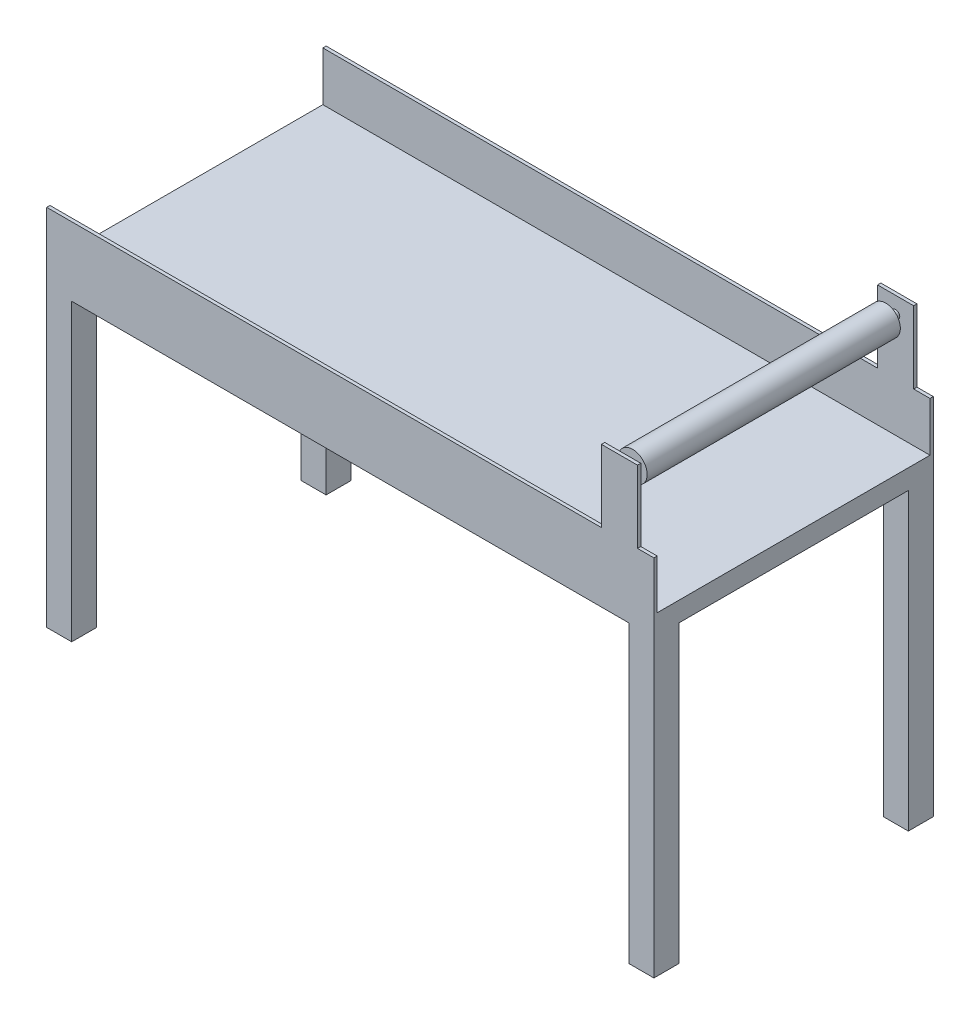
ISO-10303-21;
HEADER;
FILE_DESCRIPTION(('STEP AP214'),'2;1');
FILE_NAME('part.step','',(''),(''),'','','');
FILE_SCHEMA(('AUTOMOTIVE_DESIGN { 1 0 10303 214 1 1 1 1 }'));
ENDSEC;
DATA;
#1=APPLICATION_CONTEXT('core data for automotive mechanical design processes');
#2=APPLICATION_PROTOCOL_DEFINITION('international standard','automotive_design',2000,#1);
#3=PRODUCT_CONTEXT('',#1,'mechanical');
#4=PRODUCT('Part','Part','',(#3));
#5=PRODUCT_RELATED_PRODUCT_CATEGORY('part','',(#4));
#6=PRODUCT_DEFINITION_FORMATION('','',#4);
#7=PRODUCT_DEFINITION_CONTEXT('part definition',#1,'design');
#8=PRODUCT_DEFINITION('design','',#6,#7);
#9=PRODUCT_DEFINITION_SHAPE('','',#8);
#10=(LENGTH_UNIT() NAMED_UNIT(*) SI_UNIT(.MILLI.,.METRE.));
#11=(NAMED_UNIT(*) PLANE_ANGLE_UNIT() SI_UNIT($,.RADIAN.));
#12=(NAMED_UNIT(*) SI_UNIT($,.STERADIAN.) SOLID_ANGLE_UNIT());
#13=UNCERTAINTY_MEASURE_WITH_UNIT(LENGTH_MEASURE(1.E-05),#10,'distance_accuracy_value','');
#14=(GEOMETRIC_REPRESENTATION_CONTEXT(3) GLOBAL_UNCERTAINTY_ASSIGNED_CONTEXT((#13)) GLOBAL_UNIT_ASSIGNED_CONTEXT((#10,
#11,#12)) REPRESENTATION_CONTEXT('',''));
#15=CARTESIAN_POINT('',(0.,0.,0.));
#16=DIRECTION('',(0.,0.,1.));
#17=DIRECTION('',(1.,0.,0.));
#18=AXIS2_PLACEMENT_3D('',#15,#16,#17);
#19=CARTESIAN_POINT('',(0.,1110.,0.));
#20=DIRECTION('',(0.,1.,0.));
#21=DIRECTION('',(0.,0.,1.));
#22=AXIS2_PLACEMENT_3D('',#19,#20,#21);
#23=PLANE('',#22);
#24=DIRECTION('',(-1.,0.,0.));
#25=VECTOR('',#24,1.);
#26=CARTESIAN_POINT('',(2698.20716478403,1110.,842.4));
#27=LINE('',#26,#25);
#28=CARTESIAN_POINT('',(1852.4,1110.,842.4));
#29=VERTEX_POINT('',#28);
#30=CARTESIAN_POINT('',(1802.4,1110.,842.4));
#31=VERTEX_POINT('',#30);
#32=EDGE_CURVE('E294',#29,#31,#27,.T.);
#33=ORIENTED_EDGE('',*,*,#32,.T.);
#34=DIRECTION('',(0.,0.,-1.));
#35=VECTOR('',#34,1.);
#36=CARTESIAN_POINT('',(1802.4,1110.,852.399999999999));
#37=LINE('',#36,#35);
#38=CARTESIAN_POINT('',(1802.4,1110.,852.4));
#39=VERTEX_POINT('',#38);
#40=EDGE_CURVE('E52',#39,#31,#37,.T.);
#41=ORIENTED_EDGE('',*,*,#40,.F.);
#42=DIRECTION('',(1.,0.,0.));
#43=VECTOR('',#42,1.);
#44=CARTESIAN_POINT('',(0.,1110.,852.4));
#45=LINE('',#44,#43);
#46=CARTESIAN_POINT('',(1852.4,1110.,852.4));
#47=VERTEX_POINT('',#46);
#48=EDGE_CURVE('E246',#39,#47,#45,.T.);
#49=ORIENTED_EDGE('',*,*,#48,.T.);
#50=DIRECTION('',(0.,0.,-1.));
#51=VECTOR('',#50,1.);
#52=CARTESIAN_POINT('',(1852.4,1110.,0.));
#53=LINE('',#52,#51);
#54=EDGE_CURVE('E381',#47,#29,#53,.T.);
#55=ORIENTED_EDGE('',*,*,#54,.T.);
#56=EDGE_LOOP('',(#33,#41,#49,#55));
#57=FACE_BOUND('',#56,.T.);
#58=ADVANCED_FACE('F35',(#57),#23,.T.);
#59=CARTESIAN_POINT('',(0.,1110.,852.4));
#60=VERTEX_POINT('',#59);
#61=CARTESIAN_POINT('',(1692.4,1110.,852.4));
#62=VERTEX_POINT('',#61);
#63=EDGE_CURVE('E60',#60,#62,#45,.T.);
#64=ORIENTED_EDGE('',*,*,#63,.T.);
#65=DIRECTION('',(0.,0.,1.));
#66=VECTOR('',#65,1.);
#67=CARTESIAN_POINT('',(1692.4,1110.,852.399999999999));
#68=LINE('',#67,#66);
#69=CARTESIAN_POINT('',(1692.4,1110.,842.4));
#70=VERTEX_POINT('',#69);
#71=EDGE_CURVE('E242',#70,#62,#68,.T.);
#72=ORIENTED_EDGE('',*,*,#71,.F.);
#73=CARTESIAN_POINT('',(0.,1110.,842.4));
#74=VERTEX_POINT('',#73);
#75=EDGE_CURVE('E296',#70,#74,#27,.T.);
#76=ORIENTED_EDGE('',*,*,#75,.T.);
#77=DIRECTION('',(0.,0.,1.));
#78=VECTOR('',#77,1.);
#79=CARTESIAN_POINT('',(0.,1110.,0.));
#80=LINE('',#79,#78);
#81=EDGE_CURVE('E378',#74,#60,#80,.T.);
#82=ORIENTED_EDGE('',*,*,#81,.T.);
#83=EDGE_LOOP('',(#64,#72,#76,#82));
#84=FACE_BOUND('',#83,.T.);
#85=ADVANCED_FACE('F456',(#84),#23,.T.);
#86=DIRECTION('',(-1.,0.,0.));
#87=VECTOR('',#86,1.);
#88=CARTESIAN_POINT('',(0.,1110.,0.));
#89=LINE('',#88,#87);
#90=CARTESIAN_POINT('',(1852.4,1110.,0.));
#91=VERTEX_POINT('',#90);
#92=CARTESIAN_POINT('',(1802.4,1110.,0.));
#93=VERTEX_POINT('',#92);
#94=EDGE_CURVE('E385',#91,#93,#89,.T.);
#95=ORIENTED_EDGE('',*,*,#94,.T.);
#96=DIRECTION('',(0.,0.,-1.));
#97=VECTOR('',#96,1.);
#98=CARTESIAN_POINT('',(1802.4,1110.,0.));
#99=LINE('',#98,#97);
#100=CARTESIAN_POINT('',(1802.4,1110.,9.99999999999966));
#101=VERTEX_POINT('',#100);
#102=EDGE_CURVE('E247',#101,#93,#99,.T.);
#103=ORIENTED_EDGE('',*,*,#102,.F.);
#104=DIRECTION('',(-1.,0.,0.));
#105=VECTOR('',#104,1.);
#106=CARTESIAN_POINT('',(2698.20716478403,1110.,9.99999999999967));
#107=LINE('',#106,#105);
#108=CARTESIAN_POINT('',(1852.4,1110.,9.99999999999967));
#109=VERTEX_POINT('',#108);
#110=EDGE_CURVE('E279',#109,#101,#107,.T.);
#111=ORIENTED_EDGE('',*,*,#110,.F.);
#112=EDGE_CURVE('E380',#109,#91,#53,.T.);
#113=ORIENTED_EDGE('',*,*,#112,.T.);
#114=EDGE_LOOP('',(#95,#103,#111,#113));
#115=FACE_BOUND('',#114,.T.);
#116=ADVANCED_FACE('F458',(#115),#23,.T.);
#117=CARTESIAN_POINT('',(1692.4,1110.,9.99999999999979));
#118=VERTEX_POINT('',#117);
#119=CARTESIAN_POINT('',(0.,1110.,10.));
#120=VERTEX_POINT('',#119);
#121=EDGE_CURVE('E293',#118,#120,#107,.T.);
#122=ORIENTED_EDGE('',*,*,#121,.F.);
#123=DIRECTION('',(0.,0.,1.));
#124=VECTOR('',#123,1.);
#125=CARTESIAN_POINT('',(1692.4,1110.,0.));
#126=LINE('',#125,#124);
#127=CARTESIAN_POINT('',(1692.4,1110.,0.));
#128=VERTEX_POINT('',#127);
#129=EDGE_CURVE('E250',#128,#118,#126,.T.);
#130=ORIENTED_EDGE('',*,*,#129,.F.);
#131=CARTESIAN_POINT('',(0.,1110.,0.));
#132=VERTEX_POINT('',#131);
#133=EDGE_CURVE('E384',#128,#132,#89,.T.);
#134=ORIENTED_EDGE('',*,*,#133,.T.);
#135=EDGE_CURVE('E375',#132,#120,#80,.T.);
#136=ORIENTED_EDGE('',*,*,#135,.T.);
#137=EDGE_LOOP('',(#122,#130,#134,#136));
#138=FACE_BOUND('',#137,.T.);
#139=ADVANCED_FACE('F464',(#138),#23,.T.);
#140=CARTESIAN_POINT('',(0.,900.,0.));
#141=DIRECTION('',(0.,1.,0.));
#142=DIRECTION('',(0.,0.,1.));
#143=AXIS2_PLACEMENT_3D('',#140,#141,#142);
#144=PLANE('',#143);
#145=DIRECTION('',(-1.,0.,0.));
#146=VECTOR('',#145,1.);
#147=CARTESIAN_POINT('',(1776.2,900.,776.2));
#148=LINE('',#147,#146);
#149=CARTESIAN_POINT('',(1852.4,900.,776.2));
#150=VERTEX_POINT('',#149);
#151=CARTESIAN_POINT('',(1776.2,900.,776.2));
#152=VERTEX_POINT('',#151);
#153=EDGE_CURVE('E302',#150,#152,#148,.T.);
#154=ORIENTED_EDGE('',*,*,#153,.T.);
#155=DIRECTION('',(0.,0.,1.));
#156=VECTOR('',#155,1.);
#157=CARTESIAN_POINT('',(1776.2,900.,852.4));
#158=LINE('',#157,#156);
#159=CARTESIAN_POINT('',(1776.2,900.,852.4));
#160=VERTEX_POINT('',#159);
#161=EDGE_CURVE('E305',#152,#160,#158,.T.);
#162=ORIENTED_EDGE('',*,*,#161,.T.);
#163=DIRECTION('',(1.,0.,0.));
#164=VECTOR('',#163,1.);
#165=CARTESIAN_POINT('',(0.,900.,852.4));
#166=LINE('',#165,#164);
#167=CARTESIAN_POINT('',(76.2,900.,852.4));
#168=VERTEX_POINT('',#167);
#169=EDGE_CURVE('E391',#168,#160,#166,.T.);
#170=ORIENTED_EDGE('',*,*,#169,.F.);
#171=DIRECTION('',(0.,0.,-1.));
#172=VECTOR('',#171,1.);
#173=CARTESIAN_POINT('',(76.2,900.,852.4));
#174=LINE('',#173,#172);
#175=CARTESIAN_POINT('',(76.2,900.,776.2));
#176=VERTEX_POINT('',#175);
#177=EDGE_CURVE('E326',#168,#176,#174,.T.);
#178=ORIENTED_EDGE('',*,*,#177,.T.);
#179=DIRECTION('',(-1.,0.,0.));
#180=VECTOR('',#179,1.);
#181=CARTESIAN_POINT('',(0.,900.,776.2));
#182=LINE('',#181,#180);
#183=CARTESIAN_POINT('',(0.,900.,776.2));
#184=VERTEX_POINT('',#183);
#185=EDGE_CURVE('E329',#176,#184,#182,.T.);
#186=ORIENTED_EDGE('',*,*,#185,.T.);
#187=DIRECTION('',(0.,0.,1.));
#188=VECTOR('',#187,1.);
#189=CARTESIAN_POINT('',(0.,900.,0.));
#190=LINE('',#189,#188);
#191=CARTESIAN_POINT('',(0.,900.,76.2));
#192=VERTEX_POINT('',#191);
#193=EDGE_CURVE('E374',#192,#184,#190,.T.);
#194=ORIENTED_EDGE('',*,*,#193,.F.);
#195=DIRECTION('',(1.,0.,0.));
#196=VECTOR('',#195,1.);
#197=CARTESIAN_POINT('',(0.,900.,76.2));
#198=LINE('',#197,#196);
#199=CARTESIAN_POINT('',(76.2,900.,76.2));
#200=VERTEX_POINT('',#199);
#201=EDGE_CURVE('E404',#192,#200,#198,.T.);
#202=ORIENTED_EDGE('',*,*,#201,.T.);
#203=DIRECTION('',(0.,0.,-1.));
#204=VECTOR('',#203,1.);
#205=CARTESIAN_POINT('',(76.2,900.,0.));
#206=LINE('',#205,#204);
#207=CARTESIAN_POINT('',(76.2,900.,0.));
#208=VERTEX_POINT('',#207);
#209=EDGE_CURVE('E407',#200,#208,#206,.T.);
#210=ORIENTED_EDGE('',*,*,#209,.T.);
#211=DIRECTION('',(-1.,0.,0.));
#212=VECTOR('',#211,1.);
#213=CARTESIAN_POINT('',(0.,900.,0.));
#214=LINE('',#213,#212);
#215=CARTESIAN_POINT('',(1776.2,900.,0.));
#216=VERTEX_POINT('',#215);
#217=EDGE_CURVE('E396',#216,#208,#214,.T.);
#218=ORIENTED_EDGE('',*,*,#217,.F.);
#219=DIRECTION('',(0.,0.,1.));
#220=VECTOR('',#219,1.);
#221=CARTESIAN_POINT('',(1776.2,900.,0.));
#222=LINE('',#221,#220);
#223=CARTESIAN_POINT('',(1776.2,900.,76.2));
#224=VERTEX_POINT('',#223);
#225=EDGE_CURVE('E351',#216,#224,#222,.T.);
#226=ORIENTED_EDGE('',*,*,#225,.T.);
#227=DIRECTION('',(1.,0.,0.));
#228=VECTOR('',#227,1.);
#229=CARTESIAN_POINT('',(1776.2,900.,76.2));
#230=LINE('',#229,#228);
#231=CARTESIAN_POINT('',(1852.4,900.,76.2));
#232=VERTEX_POINT('',#231);
#233=EDGE_CURVE('E354',#224,#232,#230,.T.);
#234=ORIENTED_EDGE('',*,*,#233,.T.);
#235=DIRECTION('',(0.,0.,-1.));
#236=VECTOR('',#235,1.);
#237=CARTESIAN_POINT('',(1852.4,900.,0.));
#238=LINE('',#237,#236);
#239=EDGE_CURVE('E394',#150,#232,#238,.T.);
#240=ORIENTED_EDGE('',*,*,#239,.F.);
#241=EDGE_LOOP('',(#154,#162,#170,#178,#186,#194,#202,#210,#218,#226,#234,#240));
#242=FACE_BOUND('',#241,.T.);
#243=ADVANCED_FACE('F470',(#242),#144,.F.);
#244=CARTESIAN_POINT('',(0.,900.,0.));
#245=DIRECTION('',(1.,0.,0.));
#246=DIRECTION('',(0.,0.,-1.));
#247=AXIS2_PLACEMENT_3D('',#244,#245,#246);
#248=PLANE('',#247);
#249=DIRECTION('',(0.,0.,1.));
#250=VECTOR('',#249,1.);
#251=CARTESIAN_POINT('',(0.,960.,10.));
#252=LINE('',#251,#250);
#253=CARTESIAN_POINT('',(0.,960.,10.));
#254=VERTEX_POINT('',#253);
#255=CARTESIAN_POINT('',(1.03164246360173E-13,960.,842.4));
#256=VERTEX_POINT('',#255);
#257=EDGE_CURVE('E284',#254,#256,#252,.T.);
#258=ORIENTED_EDGE('',*,*,#257,.F.);
#259=DIRECTION('',(0.,-1.,0.));
#260=VECTOR('',#259,1.);
#261=CARTESIAN_POINT('',(0.,1110.,10.));
#262=LINE('',#261,#260);
#263=EDGE_CURVE('E275',#120,#254,#262,.T.);
#264=ORIENTED_EDGE('',*,*,#263,.F.);
#265=ORIENTED_EDGE('',*,*,#135,.F.);
#266=DIRECTION('',(0.,-1.,0.));
#267=VECTOR('',#266,1.);
#268=CARTESIAN_POINT('',(0.,900.,0.));
#269=LINE('',#268,#267);
#270=CARTESIAN_POINT('',(0.,0.,0.));
#271=VERTEX_POINT('',#270);
#272=EDGE_CURVE('E411',#132,#271,#269,.T.);
#273=ORIENTED_EDGE('',*,*,#272,.T.);
#274=DIRECTION('',(0.,0.,1.));
#275=VECTOR('',#274,1.);
#276=CARTESIAN_POINT('',(0.,0.,0.));
#277=LINE('',#276,#275);
#278=CARTESIAN_POINT('',(0.,0.,76.2));
#279=VERTEX_POINT('',#278);
#280=EDGE_CURVE('E403',#271,#279,#277,.T.);
#281=ORIENTED_EDGE('',*,*,#280,.T.);
#282=DIRECTION('',(0.,-1.,0.));
#283=VECTOR('',#282,1.);
#284=CARTESIAN_POINT('',(0.,900.,76.2));
#285=LINE('',#284,#283);
#286=EDGE_CURVE('E11',#192,#279,#285,.T.);
#287=ORIENTED_EDGE('',*,*,#286,.F.);
#288=ORIENTED_EDGE('',*,*,#193,.T.);
#289=DIRECTION('',(0.,-1.,0.));
#290=VECTOR('',#289,1.);
#291=CARTESIAN_POINT('',(0.,900.,776.2));
#292=LINE('',#291,#290);
#293=CARTESIAN_POINT('',(0.,0.,776.2));
#294=VERTEX_POINT('',#293);
#295=EDGE_CURVE('E333',#184,#294,#292,.T.);
#296=ORIENTED_EDGE('',*,*,#295,.T.);
#297=DIRECTION('',(0.,0.,1.));
#298=VECTOR('',#297,1.);
#299=CARTESIAN_POINT('',(0.,0.,852.4));
#300=LINE('',#299,#298);
#301=CARTESIAN_POINT('',(0.,0.,852.4));
#302=VERTEX_POINT('',#301);
#303=EDGE_CURVE('E330',#294,#302,#300,.T.);
#304=ORIENTED_EDGE('',*,*,#303,.T.);
#305=DIRECTION('',(0.,-1.,0.));
#306=VECTOR('',#305,1.);
#307=CARTESIAN_POINT('',(0.,1110.,852.4));
#308=LINE('',#307,#306);
#309=EDGE_CURVE('E401',#60,#302,#308,.T.);
#310=ORIENTED_EDGE('',*,*,#309,.F.);
#311=ORIENTED_EDGE('',*,*,#81,.F.);
#312=DIRECTION('',(0.,1.,0.));
#313=VECTOR('',#312,1.);
#314=CARTESIAN_POINT('',(1.03164246360173E-13,1110.,842.4));
#315=LINE('',#314,#313);
#316=EDGE_CURVE('E287',#256,#74,#315,.T.);
#317=ORIENTED_EDGE('',*,*,#316,.F.);
#318=EDGE_LOOP('',(#258,#264,#265,#273,#281,#287,#288,#296,#304,#310,#311,#317));
#319=FACE_BOUND('',#318,.T.);
#320=ADVANCED_FACE('F37',(#319),#248,.F.);
#321=CARTESIAN_POINT('',(0.,900.,76.2));
#322=DIRECTION('',(0.,0.,-1.));
#323=DIRECTION('',(-1.,0.,0.));
#324=AXIS2_PLACEMENT_3D('',#321,#322,#323);
#325=PLANE('',#324);
#326=DIRECTION('',(1.,0.,0.));
#327=VECTOR('',#326,1.);
#328=CARTESIAN_POINT('',(0.,0.,76.2));
#329=LINE('',#328,#327);
#330=CARTESIAN_POINT('',(76.2,0.,76.2));
#331=VERTEX_POINT('',#330);
#332=EDGE_CURVE('E414',#279,#331,#329,.T.);
#333=ORIENTED_EDGE('',*,*,#332,.T.);
#334=DIRECTION('',(0.,-1.,0.));
#335=VECTOR('',#334,1.);
#336=CARTESIAN_POINT('',(76.2,900.,76.2));
#337=LINE('',#336,#335);
#338=EDGE_CURVE('E44',#200,#331,#337,.T.);
#339=ORIENTED_EDGE('',*,*,#338,.F.);
#340=ORIENTED_EDGE('',*,*,#201,.F.);
#341=ORIENTED_EDGE('',*,*,#286,.T.);
#342=EDGE_LOOP('',(#333,#339,#340,#341));
#343=FACE_BOUND('',#342,.T.);
#344=ADVANCED_FACE('F490',(#343),#325,.F.);
#345=CARTESIAN_POINT('',(76.2,900.,0.));
#346=DIRECTION('',(-1.,0.,0.));
#347=DIRECTION('',(0.,0.,1.));
#348=AXIS2_PLACEMENT_3D('',#345,#346,#347);
#349=PLANE('',#348);
#350=DIRECTION('',(0.,0.,-1.));
#351=VECTOR('',#350,1.);
#352=CARTESIAN_POINT('',(76.2,0.,0.));
#353=LINE('',#352,#351);
#354=CARTESIAN_POINT('',(76.2,0.,0.));
#355=VERTEX_POINT('',#354);
#356=EDGE_CURVE('E416',#331,#355,#353,.T.);
#357=ORIENTED_EDGE('',*,*,#356,.T.);
#358=DIRECTION('',(0.,-1.,0.));
#359=VECTOR('',#358,1.);
#360=CARTESIAN_POINT('',(76.2,900.,0.));
#361=LINE('',#360,#359);
#362=EDGE_CURVE('E421',#208,#355,#361,.T.);
#363=ORIENTED_EDGE('',*,*,#362,.F.);
#364=ORIENTED_EDGE('',*,*,#209,.F.);
#365=ORIENTED_EDGE('',*,*,#338,.T.);
#366=EDGE_LOOP('',(#357,#363,#364,#365));
#367=FACE_BOUND('',#366,.T.);
#368=ADVANCED_FACE('F487',(#367),#349,.F.);
#369=CARTESIAN_POINT('',(0.,900.,0.));
#370=DIRECTION('',(0.,0.,1.));
#371=DIRECTION('',(1.,0.,0.));
#372=AXIS2_PLACEMENT_3D('',#369,#370,#371);
#373=PLANE('',#372);
#374=DIRECTION('',(-1.,0.,0.));
#375=VECTOR('',#374,1.);
#376=CARTESIAN_POINT('',(0.,0.,0.));
#377=LINE('',#376,#375);
#378=EDGE_CURVE('E408',#355,#271,#377,.T.);
#379=ORIENTED_EDGE('',*,*,#378,.T.);
#380=ORIENTED_EDGE('',*,*,#272,.F.);
#381=ORIENTED_EDGE('',*,*,#133,.F.);
#382=DIRECTION('',(0.,-1.,0.));
#383=VECTOR('',#382,1.);
#384=CARTESIAN_POINT('',(1692.4,1330.,0.));
#385=LINE('',#384,#383);
#386=CARTESIAN_POINT('',(1692.4,1330.,0.));
#387=VERTEX_POINT('',#386);
#388=EDGE_CURVE('E271',#387,#128,#385,.T.);
#389=ORIENTED_EDGE('',*,*,#388,.F.);
#390=DIRECTION('',(-1.,0.,0.));
#391=VECTOR('',#390,1.);
#392=CARTESIAN_POINT('',(1802.4,1330.,0.));
#393=LINE('',#392,#391);
#394=CARTESIAN_POINT('',(1802.4,1330.,0.));
#395=VERTEX_POINT('',#394);
#396=EDGE_CURVE('E259',#395,#387,#393,.T.);
#397=ORIENTED_EDGE('',*,*,#396,.F.);
#398=DIRECTION('',(0.,-1.,0.));
#399=VECTOR('',#398,1.);
#400=CARTESIAN_POINT('',(1802.4,1330.,0.));
#401=LINE('',#400,#399);
#402=EDGE_CURVE('E273',#395,#93,#401,.T.);
#403=ORIENTED_EDGE('',*,*,#402,.T.);
#404=ORIENTED_EDGE('',*,*,#94,.F.);
#405=DIRECTION('',(0.,-1.,0.));
#406=VECTOR('',#405,1.);
#407=CARTESIAN_POINT('',(1852.4,1110.,0.));
#408=LINE('',#407,#406);
#409=CARTESIAN_POINT('',(1852.4,0.,0.));
#410=VERTEX_POINT('',#409);
#411=EDGE_CURVE('E388',#91,#410,#408,.T.);
#412=ORIENTED_EDGE('',*,*,#411,.T.);
#413=DIRECTION('',(-1.,0.,0.));
#414=VECTOR('',#413,1.);
#415=CARTESIAN_POINT('',(1776.2,0.,0.));
#416=LINE('',#415,#414);
#417=CARTESIAN_POINT('',(1776.2,0.,0.));
#418=VERTEX_POINT('',#417);
#419=EDGE_CURVE('E361',#410,#418,#416,.T.);
#420=ORIENTED_EDGE('',*,*,#419,.T.);
#421=DIRECTION('',(0.,-1.,0.));
#422=VECTOR('',#421,1.);
#423=CARTESIAN_POINT('',(1776.2,900.,0.));
#424=LINE('',#423,#422);
#425=EDGE_CURVE('E371',#216,#418,#424,.T.);
#426=ORIENTED_EDGE('',*,*,#425,.F.);
#427=ORIENTED_EDGE('',*,*,#217,.T.);
#428=ORIENTED_EDGE('',*,*,#362,.T.);
#429=EDGE_LOOP('',(#379,#380,#381,#389,#397,#403,#404,#412,#420,#426,#427,#428));
#430=FACE_BOUND('',#429,.T.);
#431=ADVANCED_FACE('F483',(#430),#373,.F.);
#432=CARTESIAN_POINT('',(0.,0.,0.));
#433=DIRECTION('',(0.,1.,0.));
#434=DIRECTION('',(0.,0.,1.));
#435=AXIS2_PLACEMENT_3D('',#432,#433,#434);
#436=PLANE('',#435);
#437=ORIENTED_EDGE('',*,*,#280,.F.);
#438=ORIENTED_EDGE('',*,*,#378,.F.);
#439=ORIENTED_EDGE('',*,*,#356,.F.);
#440=ORIENTED_EDGE('',*,*,#332,.F.);
#441=EDGE_LOOP('',(#437,#438,#439,#440));
#442=FACE_BOUND('',#441,.T.);
#443=ADVANCED_FACE('F480',(#442),#436,.F.);
#444=CARTESIAN_POINT('',(0.,1110.,852.4));
#445=DIRECTION('',(0.,0.,-1.));
#446=DIRECTION('',(-1.,0.,0.));
#447=AXIS2_PLACEMENT_3D('',#444,#445,#446);
#448=PLANE('',#447);
#449=ORIENTED_EDGE('',*,*,#309,.T.);
#450=DIRECTION('',(1.,0.,0.));
#451=VECTOR('',#450,1.);
#452=CARTESIAN_POINT('',(0.,0.,852.4));
#453=LINE('',#452,#451);
#454=CARTESIAN_POINT('',(76.2,0.,852.4));
#455=VERTEX_POINT('',#454);
#456=EDGE_CURVE('E325',#302,#455,#453,.T.);
#457=ORIENTED_EDGE('',*,*,#456,.T.);
#458=DIRECTION('',(0.,-1.,0.));
#459=VECTOR('',#458,1.);
#460=CARTESIAN_POINT('',(76.2,900.,852.4));
#461=LINE('',#460,#459);
#462=EDGE_CURVE('E347',#168,#455,#461,.T.);
#463=ORIENTED_EDGE('',*,*,#462,.F.);
#464=ORIENTED_EDGE('',*,*,#169,.T.);
#465=DIRECTION('',(0.,-1.,0.));
#466=VECTOR('',#465,1.);
#467=CARTESIAN_POINT('',(1776.2,900.,852.4));
#468=LINE('',#467,#466);
#469=CARTESIAN_POINT('',(1776.2,0.,852.4));
#470=VERTEX_POINT('',#469);
#471=EDGE_CURVE('E309',#160,#470,#468,.T.);
#472=ORIENTED_EDGE('',*,*,#471,.T.);
#473=DIRECTION('',(1.,0.,0.));
#474=VECTOR('',#473,1.);
#475=CARTESIAN_POINT('',(1776.2,0.,852.4));
#476=LINE('',#475,#474);
#477=CARTESIAN_POINT('',(1852.4,0.,852.4));
#478=VERTEX_POINT('',#477);
#479=EDGE_CURVE('E301',#470,#478,#476,.T.);
#480=ORIENTED_EDGE('',*,*,#479,.T.);
#481=DIRECTION('',(0.,-1.,0.));
#482=VECTOR('',#481,1.);
#483=CARTESIAN_POINT('',(1852.4,1110.,852.4));
#484=LINE('',#483,#482);
#485=EDGE_CURVE('E399',#47,#478,#484,.T.);
#486=ORIENTED_EDGE('',*,*,#485,.F.);
#487=ORIENTED_EDGE('',*,*,#48,.F.);
#488=DIRECTION('',(0.,-1.,0.));
#489=VECTOR('',#488,1.);
#490=CARTESIAN_POINT('',(1802.4,1330.,852.399999999999));
#491=LINE('',#490,#489);
#492=CARTESIAN_POINT('',(1802.4,1330.,852.399999999999));
#493=VERTEX_POINT('',#492);
#494=EDGE_CURVE('E227',#493,#39,#491,.T.);
#495=ORIENTED_EDGE('',*,*,#494,.F.);
#496=DIRECTION('',(1.,0.,0.));
#497=VECTOR('',#496,1.);
#498=CARTESIAN_POINT('',(1802.4,1330.,852.399999999999));
#499=LINE('',#498,#497);
#500=CARTESIAN_POINT('',(1692.4,1330.,852.399999999999));
#501=VERTEX_POINT('',#500);
#502=EDGE_CURVE('E233',#501,#493,#499,.T.);
#503=ORIENTED_EDGE('',*,*,#502,.F.);
#504=DIRECTION('',(0.,-1.,0.));
#505=VECTOR('',#504,1.);
#506=CARTESIAN_POINT('',(1692.4,1330.,852.399999999999));
#507=LINE('',#506,#505);
#508=EDGE_CURVE('E445',#501,#62,#507,.T.);
#509=ORIENTED_EDGE('',*,*,#508,.T.);
#510=ORIENTED_EDGE('',*,*,#63,.F.);
#511=EDGE_LOOP('',(#449,#457,#463,#464,#472,#480,#486,#487,#495,#503,#509,#510));
#512=FACE_BOUND('',#511,.T.);
#513=ADVANCED_FACE('F244',(#512),#448,.F.);
#514=CARTESIAN_POINT('',(1852.4,1110.,0.));
#515=DIRECTION('',(-1.,0.,0.));
#516=DIRECTION('',(0.,0.,1.));
#517=AXIS2_PLACEMENT_3D('',#514,#515,#516);
#518=PLANE('',#517);
#519=ORIENTED_EDGE('',*,*,#112,.F.);
#520=DIRECTION('',(0.,1.,0.));
#521=VECTOR('',#520,1.);
#522=CARTESIAN_POINT('',(1852.4,1110.,9.99999999999977));
#523=LINE('',#522,#521);
#524=CARTESIAN_POINT('',(1852.4,960.,9.99999999999969));
#525=VERTEX_POINT('',#524);
#526=EDGE_CURVE('E278',#525,#109,#523,.T.);
#527=ORIENTED_EDGE('',*,*,#526,.F.);
#528=DIRECTION('',(0.,0.,-1.));
#529=VECTOR('',#528,1.);
#530=CARTESIAN_POINT('',(1852.4,960.,9.99999999999991));
#531=LINE('',#530,#529);
#532=CARTESIAN_POINT('',(1852.4,960.,842.4));
#533=VERTEX_POINT('',#532);
#534=EDGE_CURVE('E281',#533,#525,#531,.T.);
#535=ORIENTED_EDGE('',*,*,#534,.F.);
#536=DIRECTION('',(0.,-1.,0.));
#537=VECTOR('',#536,1.);
#538=CARTESIAN_POINT('',(1852.4,1110.,842.4));
#539=LINE('',#538,#537);
#540=EDGE_CURVE('E276',#29,#533,#539,.T.);
#541=ORIENTED_EDGE('',*,*,#540,.F.);
#542=ORIENTED_EDGE('',*,*,#54,.F.);
#543=ORIENTED_EDGE('',*,*,#485,.T.);
#544=DIRECTION('',(0.,0.,-1.));
#545=VECTOR('',#544,1.);
#546=CARTESIAN_POINT('',(1852.4,0.,852.4));
#547=LINE('',#546,#545);
#548=CARTESIAN_POINT('',(1852.4,0.,776.2));
#549=VERTEX_POINT('',#548);
#550=EDGE_CURVE('E312',#478,#549,#547,.T.);
#551=ORIENTED_EDGE('',*,*,#550,.T.);
#552=DIRECTION('',(0.,-1.,0.));
#553=VECTOR('',#552,1.);
#554=CARTESIAN_POINT('',(1852.4,900.,776.2));
#555=LINE('',#554,#553);
#556=EDGE_CURVE('E322',#150,#549,#555,.T.);
#557=ORIENTED_EDGE('',*,*,#556,.F.);
#558=ORIENTED_EDGE('',*,*,#239,.T.);
#559=DIRECTION('',(0.,-1.,0.));
#560=VECTOR('',#559,1.);
#561=CARTESIAN_POINT('',(1852.4,900.,76.2));
#562=LINE('',#561,#560);
#563=CARTESIAN_POINT('',(1852.4,0.,76.2));
#564=VERTEX_POINT('',#563);
#565=EDGE_CURVE('E358',#232,#564,#562,.T.);
#566=ORIENTED_EDGE('',*,*,#565,.T.);
#567=DIRECTION('',(0.,0.,-1.));
#568=VECTOR('',#567,1.);
#569=CARTESIAN_POINT('',(1852.4,0.,0.));
#570=LINE('',#569,#568);
#571=EDGE_CURVE('E350',#564,#410,#570,.T.);
#572=ORIENTED_EDGE('',*,*,#571,.T.);
#573=ORIENTED_EDGE('',*,*,#411,.F.);
#574=EDGE_LOOP('',(#519,#527,#535,#541,#542,#543,#551,#557,#558,#566,#572,#573));
#575=FACE_BOUND('',#574,.T.);
#576=ADVANCED_FACE('F474',(#575),#518,.F.);
#577=CARTESIAN_POINT('',(1776.2,900.,0.));
#578=DIRECTION('',(1.,0.,0.));
#579=DIRECTION('',(0.,0.,-1.));
#580=AXIS2_PLACEMENT_3D('',#577,#578,#579);
#581=PLANE('',#580);
#582=DIRECTION('',(0.,0.,1.));
#583=VECTOR('',#582,1.);
#584=CARTESIAN_POINT('',(1776.2,0.,0.));
#585=LINE('',#584,#583);
#586=CARTESIAN_POINT('',(1776.2,0.,76.2));
#587=VERTEX_POINT('',#586);
#588=EDGE_CURVE('E363',#418,#587,#585,.T.);
#589=ORIENTED_EDGE('',*,*,#588,.T.);
#590=DIRECTION('',(0.,-1.,0.));
#591=VECTOR('',#590,1.);
#592=CARTESIAN_POINT('',(1776.2,900.,76.2));
#593=LINE('',#592,#591);
#594=EDGE_CURVE('E368',#224,#587,#593,.T.);
#595=ORIENTED_EDGE('',*,*,#594,.F.);
#596=ORIENTED_EDGE('',*,*,#225,.F.);
#597=ORIENTED_EDGE('',*,*,#425,.T.);
#598=EDGE_LOOP('',(#589,#595,#596,#597));
#599=FACE_BOUND('',#598,.T.);
#600=ADVANCED_FACE('F468',(#599),#581,.F.);
#601=CARTESIAN_POINT('',(1776.2,900.,76.2));
#602=DIRECTION('',(0.,0.,-1.));
#603=DIRECTION('',(-1.,0.,0.));
#604=AXIS2_PLACEMENT_3D('',#601,#602,#603);
#605=PLANE('',#604);
#606=DIRECTION('',(1.,0.,0.));
#607=VECTOR('',#606,1.);
#608=CARTESIAN_POINT('',(1776.2,0.,76.2));
#609=LINE('',#608,#607);
#610=EDGE_CURVE('E355',#587,#564,#609,.T.);
#611=ORIENTED_EDGE('',*,*,#610,.T.);
#612=ORIENTED_EDGE('',*,*,#565,.F.);
#613=ORIENTED_EDGE('',*,*,#233,.F.);
#614=ORIENTED_EDGE('',*,*,#594,.T.);
#615=EDGE_LOOP('',(#611,#612,#613,#614));
#616=FACE_BOUND('',#615,.T.);
#617=ADVANCED_FACE('F576',(#616),#605,.F.);
#618=CARTESIAN_POINT('',(0.,0.,0.));
#619=DIRECTION('',(0.,1.,0.));
#620=DIRECTION('',(0.,0.,1.));
#621=AXIS2_PLACEMENT_3D('',#618,#619,#620);
#622=PLANE('',#621);
#623=ORIENTED_EDGE('',*,*,#571,.F.);
#624=ORIENTED_EDGE('',*,*,#610,.F.);
#625=ORIENTED_EDGE('',*,*,#588,.F.);
#626=ORIENTED_EDGE('',*,*,#419,.F.);
#627=EDGE_LOOP('',(#623,#624,#625,#626));
#628=FACE_BOUND('',#627,.T.);
#629=ADVANCED_FACE('F536',(#628),#622,.F.);
#630=CARTESIAN_POINT('',(76.2,900.,852.4));
#631=DIRECTION('',(-1.,0.,0.));
#632=DIRECTION('',(0.,0.,1.));
#633=AXIS2_PLACEMENT_3D('',#630,#631,#632);
#634=PLANE('',#633);
#635=DIRECTION('',(0.,0.,-1.));
#636=VECTOR('',#635,1.);
#637=CARTESIAN_POINT('',(76.2,0.,852.4));
#638=LINE('',#637,#636);
#639=CARTESIAN_POINT('',(76.2,0.,776.2));
#640=VERTEX_POINT('',#639);
#641=EDGE_CURVE('E336',#455,#640,#638,.T.);
#642=ORIENTED_EDGE('',*,*,#641,.T.);
#643=DIRECTION('',(0.,-1.,0.));
#644=VECTOR('',#643,1.);
#645=CARTESIAN_POINT('',(76.2,900.,776.2));
#646=LINE('',#645,#644);
#647=EDGE_CURVE('E344',#176,#640,#646,.T.);
#648=ORIENTED_EDGE('',*,*,#647,.F.);
#649=ORIENTED_EDGE('',*,*,#177,.F.);
#650=ORIENTED_EDGE('',*,*,#462,.T.);
#651=EDGE_LOOP('',(#642,#648,#649,#650));
#652=FACE_BOUND('',#651,.T.);
#653=ADVANCED_FACE('F582',(#652),#634,.F.);
#654=CARTESIAN_POINT('',(0.,900.,776.2));
#655=DIRECTION('',(0.,0.,1.));
#656=DIRECTION('',(1.,0.,0.));
#657=AXIS2_PLACEMENT_3D('',#654,#655,#656);
#658=PLANE('',#657);
#659=DIRECTION('',(-1.,0.,0.));
#660=VECTOR('',#659,1.);
#661=CARTESIAN_POINT('',(0.,0.,776.2));
#662=LINE('',#661,#660);
#663=EDGE_CURVE('E338',#640,#294,#662,.T.);
#664=ORIENTED_EDGE('',*,*,#663,.T.);
#665=ORIENTED_EDGE('',*,*,#295,.F.);
#666=ORIENTED_EDGE('',*,*,#185,.F.);
#667=ORIENTED_EDGE('',*,*,#647,.T.);
#668=EDGE_LOOP('',(#664,#665,#666,#667));
#669=FACE_BOUND('',#668,.T.);
#670=ADVANCED_FACE('F587',(#669),#658,.F.);
#671=CARTESIAN_POINT('',(0.,0.,0.));
#672=DIRECTION('',(0.,1.,0.));
#673=DIRECTION('',(0.,0.,1.));
#674=AXIS2_PLACEMENT_3D('',#671,#672,#673);
#675=PLANE('',#674);
#676=ORIENTED_EDGE('',*,*,#456,.F.);
#677=ORIENTED_EDGE('',*,*,#303,.F.);
#678=ORIENTED_EDGE('',*,*,#663,.F.);
#679=ORIENTED_EDGE('',*,*,#641,.F.);
#680=EDGE_LOOP('',(#676,#677,#678,#679));
#681=FACE_BOUND('',#680,.T.);
#682=ADVANCED_FACE('F550',(#681),#675,.F.);
#683=CARTESIAN_POINT('',(1776.2,900.,776.2));
#684=DIRECTION('',(0.,0.,1.));
#685=DIRECTION('',(1.,0.,0.));
#686=AXIS2_PLACEMENT_3D('',#683,#684,#685);
#687=PLANE('',#686);
#688=DIRECTION('',(-1.,0.,0.));
#689=VECTOR('',#688,1.);
#690=CARTESIAN_POINT('',(1776.2,0.,776.2));
#691=LINE('',#690,#689);
#692=CARTESIAN_POINT('',(1776.2,0.,776.2));
#693=VERTEX_POINT('',#692);
#694=EDGE_CURVE('E314',#549,#693,#691,.T.);
#695=ORIENTED_EDGE('',*,*,#694,.T.);
#696=DIRECTION('',(0.,-1.,0.));
#697=VECTOR('',#696,1.);
#698=CARTESIAN_POINT('',(1776.2,900.,776.2));
#699=LINE('',#698,#697);
#700=EDGE_CURVE('E319',#152,#693,#699,.T.);
#701=ORIENTED_EDGE('',*,*,#700,.F.);
#702=ORIENTED_EDGE('',*,*,#153,.F.);
#703=ORIENTED_EDGE('',*,*,#556,.T.);
#704=EDGE_LOOP('',(#695,#701,#702,#703));
#705=FACE_BOUND('',#704,.T.);
#706=ADVANCED_FACE('F569',(#705),#687,.F.);
#707=CARTESIAN_POINT('',(1776.2,900.,852.4));
#708=DIRECTION('',(1.,0.,0.));
#709=DIRECTION('',(0.,0.,-1.));
#710=AXIS2_PLACEMENT_3D('',#707,#708,#709);
#711=PLANE('',#710);
#712=DIRECTION('',(0.,0.,1.));
#713=VECTOR('',#712,1.);
#714=CARTESIAN_POINT('',(1776.2,0.,852.4));
#715=LINE('',#714,#713);
#716=EDGE_CURVE('E306',#693,#470,#715,.T.);
#717=ORIENTED_EDGE('',*,*,#716,.T.);
#718=ORIENTED_EDGE('',*,*,#471,.F.);
#719=ORIENTED_EDGE('',*,*,#161,.F.);
#720=ORIENTED_EDGE('',*,*,#700,.T.);
#721=EDGE_LOOP('',(#717,#718,#719,#720));
#722=FACE_BOUND('',#721,.T.);
#723=ADVANCED_FACE('F572',(#722),#711,.F.);
#724=CARTESIAN_POINT('',(0.,0.,0.));
#725=DIRECTION('',(0.,1.,0.));
#726=DIRECTION('',(0.,0.,1.));
#727=AXIS2_PLACEMENT_3D('',#724,#725,#726);
#728=PLANE('',#727);
#729=ORIENTED_EDGE('',*,*,#479,.F.);
#730=ORIENTED_EDGE('',*,*,#716,.F.);
#731=ORIENTED_EDGE('',*,*,#694,.F.);
#732=ORIENTED_EDGE('',*,*,#550,.F.);
#733=EDGE_LOOP('',(#729,#730,#731,#732));
#734=FACE_BOUND('',#733,.T.);
#735=ADVANCED_FACE('F566',(#734),#728,.F.);
#736=CARTESIAN_POINT('',(2698.20716478403,1110.,9.99999999999967));
#737=DIRECTION('',(0.,0.,-1.));
#738=DIRECTION('',(0.,1.,0.));
#739=AXIS2_PLACEMENT_3D('',#736,#737,#738);
#740=PLANE('',#739);
#741=CARTESIAN_POINT('',(1747.4,1280.,9.99999999999976));
#742=DIRECTION('',(0.,0.,-1.));
#743=DIRECTION('',(0.,1.,0.));
#744=AXIS2_PLACEMENT_3D('',#741,#742,#743);
#745=CIRCLE('',#744,12.6999999999999);
#746=CARTESIAN_POINT('',(1747.4,1292.7,9.99999999999976));
#747=VERTEX_POINT('',#746);
#748=EDGE_CURVE('E39',#747,#747,#745,.T.);
#749=ORIENTED_EDGE('',*,*,#748,.T.);
#750=EDGE_LOOP('',(#749));
#751=FACE_BOUND('',#750,.T.);
#752=ORIENTED_EDGE('',*,*,#526,.T.);
#753=ORIENTED_EDGE('',*,*,#110,.T.);
#754=DIRECTION('',(0.,-1.,0.));
#755=VECTOR('',#754,1.);
#756=CARTESIAN_POINT('',(1802.4,1330.,9.99999999999966));
#757=LINE('',#756,#755);
#758=CARTESIAN_POINT('',(1802.4,1330.,9.99999999999966));
#759=VERTEX_POINT('',#758);
#760=EDGE_CURVE('E264',#759,#101,#757,.T.);
#761=ORIENTED_EDGE('',*,*,#760,.F.);
#762=DIRECTION('',(1.,0.,0.));
#763=VECTOR('',#762,1.);
#764=CARTESIAN_POINT('',(1802.4,1330.,9.99999999999966));
#765=LINE('',#764,#763);
#766=CARTESIAN_POINT('',(1692.4,1330.,9.9999999999997));
#767=VERTEX_POINT('',#766);
#768=EDGE_CURVE('E263',#767,#759,#765,.T.);
#769=ORIENTED_EDGE('',*,*,#768,.F.);
#770=DIRECTION('',(0.,-1.,0.));
#771=VECTOR('',#770,1.);
#772=CARTESIAN_POINT('',(1692.4,1330.,9.9999999999997));
#773=LINE('',#772,#771);
#774=EDGE_CURVE('E269',#767,#118,#773,.T.);
#775=ORIENTED_EDGE('',*,*,#774,.T.);
#776=ORIENTED_EDGE('',*,*,#121,.T.);
#777=ORIENTED_EDGE('',*,*,#263,.T.);
#778=DIRECTION('',(-1.,0.,0.));
#779=VECTOR('',#778,1.);
#780=CARTESIAN_POINT('',(2698.20716478403,960.,9.99999999999969));
#781=LINE('',#780,#779);
#782=EDGE_CURVE('E290',#525,#254,#781,.T.);
#783=ORIENTED_EDGE('',*,*,#782,.F.);
#784=EDGE_LOOP('',(#752,#753,#761,#769,#775,#776,#777,#783));
#785=FACE_BOUND('',#784,.T.);
#786=ADVANCED_FACE('F558',(#751,#785),#740,.F.);
#787=CARTESIAN_POINT('',(2698.20716478403,1110.,842.4));
#788=DIRECTION('',(0.,0.,1.));
#789=DIRECTION('',(1.,0.,0.));
#790=AXIS2_PLACEMENT_3D('',#787,#788,#789);
#791=PLANE('',#790);
#792=CARTESIAN_POINT('',(1747.4,1280.,842.4));
#793=DIRECTION('',(0.,0.,1.));
#794=DIRECTION('',(1.,0.,0.));
#795=AXIS2_PLACEMENT_3D('',#792,#793,#794);
#796=CIRCLE('',#795,12.6999999999999);
#797=CARTESIAN_POINT('',(1760.1,1280.,842.4));
#798=VERTEX_POINT('',#797);
#799=EDGE_CURVE('E425',#798,#798,#796,.T.);
#800=ORIENTED_EDGE('',*,*,#799,.T.);
#801=EDGE_LOOP('',(#800));
#802=FACE_BOUND('',#801,.T.);
#803=ORIENTED_EDGE('',*,*,#540,.T.);
#804=DIRECTION('',(-1.,0.,0.));
#805=VECTOR('',#804,1.);
#806=CARTESIAN_POINT('',(2698.20716478403,960.,842.4));
#807=LINE('',#806,#805);
#808=EDGE_CURVE('E297',#533,#256,#807,.T.);
#809=ORIENTED_EDGE('',*,*,#808,.T.);
#810=ORIENTED_EDGE('',*,*,#316,.T.);
#811=ORIENTED_EDGE('',*,*,#75,.F.);
#812=DIRECTION('',(0.,-1.,0.));
#813=VECTOR('',#812,1.);
#814=CARTESIAN_POINT('',(1692.4,1330.,842.4));
#815=LINE('',#814,#813);
#816=CARTESIAN_POINT('',(1692.4,1330.,842.4));
#817=VERTEX_POINT('',#816);
#818=EDGE_CURVE('E252',#817,#70,#815,.T.);
#819=ORIENTED_EDGE('',*,*,#818,.F.);
#820=DIRECTION('',(-1.,0.,0.));
#821=VECTOR('',#820,1.);
#822=CARTESIAN_POINT('',(1802.4,1330.,842.4));
#823=LINE('',#822,#821);
#824=CARTESIAN_POINT('',(1802.4,1330.,842.4));
#825=VERTEX_POINT('',#824);
#826=EDGE_CURVE('E232',#825,#817,#823,.T.);
#827=ORIENTED_EDGE('',*,*,#826,.F.);
#828=DIRECTION('',(0.,-1.,0.));
#829=VECTOR('',#828,1.);
#830=CARTESIAN_POINT('',(1802.4,1330.,842.4));
#831=LINE('',#830,#829);
#832=EDGE_CURVE('E229',#825,#31,#831,.T.);
#833=ORIENTED_EDGE('',*,*,#832,.T.);
#834=ORIENTED_EDGE('',*,*,#32,.F.);
#835=EDGE_LOOP('',(#803,#809,#810,#811,#819,#827,#833,#834));
#836=FACE_BOUND('',#835,.T.);
#837=ADVANCED_FACE('F453',(#802,#836),#791,.F.);
#838=CARTESIAN_POINT('',(2698.20716478403,960.,9.99999999999969));
#839=DIRECTION('',(0.,-1.,0.));
#840=DIRECTION('',(0.,0.,-1.));
#841=AXIS2_PLACEMENT_3D('',#838,#839,#840);
#842=PLANE('',#841);
#843=ORIENTED_EDGE('',*,*,#534,.T.);
#844=ORIENTED_EDGE('',*,*,#782,.T.);
#845=ORIENTED_EDGE('',*,*,#257,.T.);
#846=ORIENTED_EDGE('',*,*,#808,.F.);
#847=EDGE_LOOP('',(#843,#844,#845,#846));
#848=FACE_BOUND('',#847,.T.);
#849=ADVANCED_FACE('F554',(#848),#842,.F.);
#850=CARTESIAN_POINT('',(1802.4,1330.,0.));
#851=DIRECTION('',(-1.,0.,0.));
#852=DIRECTION('',(0.,0.,1.));
#853=AXIS2_PLACEMENT_3D('',#850,#851,#852);
#854=PLANE('',#853);
#855=ORIENTED_EDGE('',*,*,#102,.T.);
#856=ORIENTED_EDGE('',*,*,#402,.F.);
#857=DIRECTION('',(0.,0.,-1.));
#858=VECTOR('',#857,1.);
#859=CARTESIAN_POINT('',(1802.4,1330.,0.));
#860=LINE('',#859,#858);
#861=EDGE_CURVE('E256',#759,#395,#860,.T.);
#862=ORIENTED_EDGE('',*,*,#861,.F.);
#863=ORIENTED_EDGE('',*,*,#760,.T.);
#864=EDGE_LOOP('',(#855,#856,#862,#863));
#865=FACE_BOUND('',#864,.T.);
#866=ADVANCED_FACE('F524',(#865),#854,.F.);
#867=CARTESIAN_POINT('',(1692.4,1330.,0.));
#868=DIRECTION('',(1.,0.,0.));
#869=DIRECTION('',(0.,0.,-1.));
#870=AXIS2_PLACEMENT_3D('',#867,#868,#869);
#871=PLANE('',#870);
#872=ORIENTED_EDGE('',*,*,#129,.T.);
#873=ORIENTED_EDGE('',*,*,#774,.F.);
#874=DIRECTION('',(0.,0.,1.));
#875=VECTOR('',#874,1.);
#876=CARTESIAN_POINT('',(1692.4,1330.,0.));
#877=LINE('',#876,#875);
#878=EDGE_CURVE('E261',#387,#767,#877,.T.);
#879=ORIENTED_EDGE('',*,*,#878,.F.);
#880=ORIENTED_EDGE('',*,*,#388,.T.);
#881=EDGE_LOOP('',(#872,#873,#879,#880));
#882=FACE_BOUND('',#881,.T.);
#883=ADVANCED_FACE('F516',(#882),#871,.F.);
#884=CARTESIAN_POINT('',(0.,1330.,0.));
#885=DIRECTION('',(0.,-1.,0.));
#886=DIRECTION('',(0.,0.,-1.));
#887=AXIS2_PLACEMENT_3D('',#884,#885,#886);
#888=PLANE('',#887);
#889=ORIENTED_EDGE('',*,*,#861,.T.);
#890=ORIENTED_EDGE('',*,*,#396,.T.);
#891=ORIENTED_EDGE('',*,*,#878,.T.);
#892=ORIENTED_EDGE('',*,*,#768,.T.);
#893=EDGE_LOOP('',(#889,#890,#891,#892));
#894=FACE_BOUND('',#893,.T.);
#895=ADVANCED_FACE('F519',(#894),#888,.F.);
#896=CARTESIAN_POINT('',(1802.4,1330.,852.399999999999));
#897=DIRECTION('',(-1.,0.,0.));
#898=DIRECTION('',(0.,0.,1.));
#899=AXIS2_PLACEMENT_3D('',#896,#897,#898);
#900=PLANE('',#899);
#901=ORIENTED_EDGE('',*,*,#40,.T.);
#902=ORIENTED_EDGE('',*,*,#832,.F.);
#903=DIRECTION('',(0.,0.,-1.));
#904=VECTOR('',#903,1.);
#905=CARTESIAN_POINT('',(1802.4,1330.,852.399999999999));
#906=LINE('',#905,#904);
#907=EDGE_CURVE('E223',#493,#825,#906,.T.);
#908=ORIENTED_EDGE('',*,*,#907,.F.);
#909=ORIENTED_EDGE('',*,*,#494,.T.);
#910=EDGE_LOOP('',(#901,#902,#908,#909));
#911=FACE_BOUND('',#910,.T.);
#912=ADVANCED_FACE('F225',(#911),#900,.F.);
#913=CARTESIAN_POINT('',(1692.4,1330.,852.399999999999));
#914=DIRECTION('',(1.,0.,0.));
#915=DIRECTION('',(0.,0.,-1.));
#916=AXIS2_PLACEMENT_3D('',#913,#914,#915);
#917=PLANE('',#916);
#918=ORIENTED_EDGE('',*,*,#71,.T.);
#919=ORIENTED_EDGE('',*,*,#508,.F.);
#920=DIRECTION('',(0.,0.,1.));
#921=VECTOR('',#920,1.);
#922=CARTESIAN_POINT('',(1692.4,1330.,852.399999999999));
#923=LINE('',#922,#921);
#924=EDGE_CURVE('E238',#817,#501,#923,.T.);
#925=ORIENTED_EDGE('',*,*,#924,.F.);
#926=ORIENTED_EDGE('',*,*,#818,.T.);
#927=EDGE_LOOP('',(#918,#919,#925,#926));
#928=FACE_BOUND('',#927,.T.);
#929=ADVANCED_FACE('F451',(#928),#917,.F.);
#930=CARTESIAN_POINT('',(0.,1330.,0.));
#931=DIRECTION('',(0.,-1.,0.));
#932=DIRECTION('',(0.,0.,-1.));
#933=AXIS2_PLACEMENT_3D('',#930,#931,#932);
#934=PLANE('',#933);
#935=ORIENTED_EDGE('',*,*,#502,.T.);
#936=ORIENTED_EDGE('',*,*,#907,.T.);
#937=ORIENTED_EDGE('',*,*,#826,.T.);
#938=ORIENTED_EDGE('',*,*,#924,.T.);
#939=EDGE_LOOP('',(#935,#936,#937,#938));
#940=FACE_BOUND('',#939,.T.);
#941=ADVANCED_FACE('F236',(#940),#934,.F.);
#942=CARTESIAN_POINT('',(1747.4,1280.,812.4));
#943=DIRECTION('',(0.,0.,1.));
#944=DIRECTION('',(1.,0.,0.));
#945=AXIS2_PLACEMENT_3D('',#942,#943,#944);
#946=CYLINDRICAL_SURFACE('',#945,12.6999999999999);
#947=CARTESIAN_POINT('',(1747.4,1280.,812.4));
#948=DIRECTION('',(0.,0.,1.));
#949=DIRECTION('',(1.,0.,0.));
#950=AXIS2_PLACEMENT_3D('',#947,#948,#949);
#951=CIRCLE('',#950,12.6999999999999);
#952=CARTESIAN_POINT('',(1760.1,1280.,812.4));
#953=VERTEX_POINT('',#952);
#954=EDGE_CURVE('E431',#953,#953,#951,.F.);
#955=ORIENTED_EDGE('',*,*,#954,.F.);
#956=EDGE_LOOP('',(#955));
#957=FACE_BOUND('',#956,.T.);
#958=ORIENTED_EDGE('',*,*,#799,.F.);
#959=EDGE_LOOP('',(#958));
#960=FACE_BOUND('',#959,.T.);
#961=ADVANCED_FACE('F617',(#957,#960),#946,.T.);
#962=CARTESIAN_POINT('',(1747.4,1280.,40.));
#963=DIRECTION('',(0.,0.,-1.));
#964=DIRECTION('',(-1.,0.,0.));
#965=AXIS2_PLACEMENT_3D('',#962,#963,#964);
#966=CYLINDRICAL_SURFACE('',#965,12.6999999999999);
#967=CARTESIAN_POINT('',(1747.4,1280.,40.));
#968=DIRECTION('',(0.,0.,1.));
#969=DIRECTION('',(1.,0.,0.));
#970=AXIS2_PLACEMENT_3D('',#967,#968,#969);
#971=CIRCLE('',#970,12.6999999999999);
#972=CARTESIAN_POINT('',(1760.1,1280.,40.));
#973=VERTEX_POINT('',#972);
#974=EDGE_CURVE('E435',#973,#973,#971,.F.);
#975=ORIENTED_EDGE('',*,*,#974,.T.);
#976=EDGE_LOOP('',(#975));
#977=FACE_BOUND('',#976,.T.);
#978=ORIENTED_EDGE('',*,*,#748,.F.);
#979=EDGE_LOOP('',(#978));
#980=FACE_BOUND('',#979,.T.);
#981=ADVANCED_FACE('F620',(#977,#980),#966,.T.);
#982=CARTESIAN_POINT('',(1747.4,1280.,938.123585694968));
#983=DIRECTION('',(0.,0.,-1.));
#984=DIRECTION('',(-1.,0.,0.));
#985=AXIS2_PLACEMENT_3D('',#982,#983,#984);
#986=CYLINDRICAL_SURFACE('',#985,44.45);
#987=CARTESIAN_POINT('',(1747.4,1280.,40.));
#988=DIRECTION('',(0.,0.,1.));
#989=DIRECTION('',(1.,0.,0.));
#990=AXIS2_PLACEMENT_3D('',#987,#988,#989);
#991=CIRCLE('',#990,44.45);
#992=CARTESIAN_POINT('',(1791.85,1280.,40.));
#993=VERTEX_POINT('',#992);
#994=EDGE_CURVE('E641',#993,#993,#991,.T.);
#995=ORIENTED_EDGE('',*,*,#994,.T.);
#996=EDGE_LOOP('',(#995));
#997=FACE_BOUND('',#996,.T.);
#998=CARTESIAN_POINT('',(1747.4,1280.,812.4));
#999=DIRECTION('',(0.,0.,1.));
#1000=DIRECTION('',(1.,0.,0.));
#1001=AXIS2_PLACEMENT_3D('',#998,#999,#1000);
#1002=CIRCLE('',#1001,44.45);
#1003=CARTESIAN_POINT('',(1791.85,1280.,812.4));
#1004=VERTEX_POINT('',#1003);
#1005=EDGE_CURVE('E440',#1004,#1004,#1002,.T.);
#1006=ORIENTED_EDGE('',*,*,#1005,.F.);
#1007=EDGE_LOOP('',(#1006));
#1008=FACE_BOUND('',#1007,.T.);
#1009=ADVANCED_FACE('F624',(#997,#1008),#986,.T.);
#1010=CARTESIAN_POINT('',(1747.4,1280.,40.));
#1011=DIRECTION('',(0.,0.,1.));
#1012=DIRECTION('',(1.,0.,0.));
#1013=AXIS2_PLACEMENT_3D('',#1010,#1011,#1012);
#1014=PLANE('',#1013);
#1015=ORIENTED_EDGE('',*,*,#974,.F.);
#1016=EDGE_LOOP('',(#1015));
#1017=FACE_BOUND('',#1016,.T.);
#1018=ORIENTED_EDGE('',*,*,#994,.F.);
#1019=EDGE_LOOP('',(#1018));
#1020=FACE_BOUND('',#1019,.T.);
#1021=ADVANCED_FACE('F629',(#1017,#1020),#1014,.F.);
#1022=CARTESIAN_POINT('',(1747.4,1280.,812.4));
#1023=DIRECTION('',(0.,0.,1.));
#1024=DIRECTION('',(1.,0.,0.));
#1025=AXIS2_PLACEMENT_3D('',#1022,#1023,#1024);
#1026=PLANE('',#1025);
#1027=ORIENTED_EDGE('',*,*,#954,.T.);
#1028=EDGE_LOOP('',(#1027));
#1029=FACE_BOUND('',#1028,.T.);
#1030=ORIENTED_EDGE('',*,*,#1005,.T.);
#1031=EDGE_LOOP('',(#1030));
#1032=FACE_BOUND('',#1031,.T.);
#1033=ADVANCED_FACE('F626',(#1029,#1032),#1026,.T.);
#1034=CLOSED_SHELL('',(#58,#85,#116,#139,#243,#320,#344,#368,#431,#443,#513,#576,#600,#617,#629,
#653,#670,#682,#706,#723,#735,#786,#837,#849,#866,#883,#895,#912,#929,#941,#961,#981,#1009,
#1021,#1033));
#1035=MANIFOLD_SOLID_BREP('B2',#1034);
#1036=ADVANCED_BREP_SHAPE_REPRESENTATION('',(#18,#1035),#14);
#1037=SHAPE_DEFINITION_REPRESENTATION(#9,#1036);
ENDSEC;
END-ISO-10303-21;
